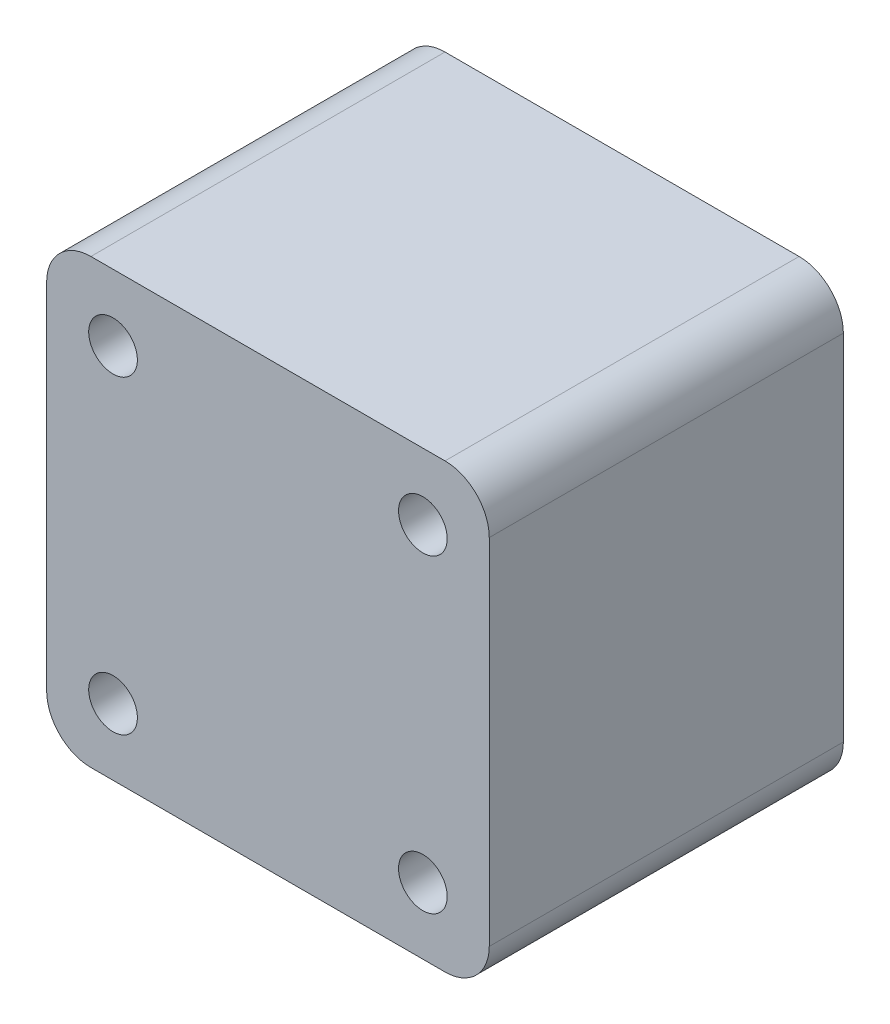
ISO-10303-21;
HEADER;
FILE_DESCRIPTION(('STEP AP214'),'2;1');
FILE_NAME('part.step','',(''),(''),'','','');
FILE_SCHEMA(('AUTOMOTIVE_DESIGN { 1 0 10303 214 1 1 1 1 }'));
ENDSEC;
DATA;
#1=APPLICATION_CONTEXT('core data for automotive mechanical design processes');
#2=APPLICATION_PROTOCOL_DEFINITION('international standard','automotive_design',2000,#1);
#3=PRODUCT_CONTEXT('',#1,'mechanical');
#4=PRODUCT('Part','Part','',(#3));
#5=PRODUCT_RELATED_PRODUCT_CATEGORY('part','',(#4));
#6=PRODUCT_DEFINITION_FORMATION('','',#4);
#7=PRODUCT_DEFINITION_CONTEXT('part definition',#1,'design');
#8=PRODUCT_DEFINITION('design','',#6,#7);
#9=PRODUCT_DEFINITION_SHAPE('','',#8);
#10=(LENGTH_UNIT() NAMED_UNIT(*) SI_UNIT(.MILLI.,.METRE.));
#11=(NAMED_UNIT(*) PLANE_ANGLE_UNIT() SI_UNIT($,.RADIAN.));
#12=(NAMED_UNIT(*) SI_UNIT($,.STERADIAN.) SOLID_ANGLE_UNIT());
#13=UNCERTAINTY_MEASURE_WITH_UNIT(LENGTH_MEASURE(1.E-05),#10,'distance_accuracy_value','');
#14=(GEOMETRIC_REPRESENTATION_CONTEXT(3) GLOBAL_UNCERTAINTY_ASSIGNED_CONTEXT((#13)) GLOBAL_UNIT_ASSIGNED_CONTEXT((#10,
#11,#12)) REPRESENTATION_CONTEXT('',''));
#15=CARTESIAN_POINT('',(0.,0.,0.));
#16=DIRECTION('',(0.,0.,1.));
#17=DIRECTION('',(1.,0.,0.));
#18=AXIS2_PLACEMENT_3D('',#15,#16,#17);
#19=CARTESIAN_POINT('',(50.,50.,80.));
#20=DIRECTION('',(-1.,0.,0.));
#21=DIRECTION('',(0.,-1.,0.));
#22=AXIS2_PLACEMENT_3D('',#19,#20,#21);
#23=PLANE('',#22);
#24=DIRECTION('',(0.,1.,0.));
#25=VECTOR('',#24,1.);
#26=CARTESIAN_POINT('',(50.,50.,0.));
#27=LINE('',#26,#25);
#28=CARTESIAN_POINT('',(50.,-40.,0.));
#29=VERTEX_POINT('',#28);
#30=CARTESIAN_POINT('',(50.,40.,0.));
#31=VERTEX_POINT('',#30);
#32=EDGE_CURVE('E127',#29,#31,#27,.T.);
#33=ORIENTED_EDGE('',*,*,#32,.T.);
#34=DIRECTION('',(0.,0.,-1.));
#35=VECTOR('',#34,1.);
#36=CARTESIAN_POINT('',(50.,40.,80.));
#37=LINE('',#36,#35);
#38=CARTESIAN_POINT('',(50.,40.,80.));
#39=VERTEX_POINT('',#38);
#40=EDGE_CURVE('E145',#31,#39,#37,.F.);
#41=ORIENTED_EDGE('',*,*,#40,.T.);
#42=DIRECTION('',(0.,1.,0.));
#43=VECTOR('',#42,1.);
#44=CARTESIAN_POINT('',(50.,50.,80.));
#45=LINE('',#44,#43);
#46=CARTESIAN_POINT('',(50.,-40.,80.));
#47=VERTEX_POINT('',#46);
#48=EDGE_CURVE('E125',#47,#39,#45,.T.);
#49=ORIENTED_EDGE('',*,*,#48,.F.);
#50=DIRECTION('',(0.,0.,-1.));
#51=VECTOR('',#50,1.);
#52=CARTESIAN_POINT('',(50.,-40.,80.));
#53=LINE('',#52,#51);
#54=EDGE_CURVE('E142',#47,#29,#53,.T.);
#55=ORIENTED_EDGE('',*,*,#54,.T.);
#56=EDGE_LOOP('',(#33,#41,#49,#55));
#57=FACE_BOUND('',#56,.T.);
#58=ADVANCED_FACE('F33',(#57),#23,.F.);
#59=CARTESIAN_POINT('',(-50.,50.,80.));
#60=DIRECTION('',(0.,-1.,0.));
#61=DIRECTION('',(0.,0.,-1.));
#62=AXIS2_PLACEMENT_3D('',#59,#60,#61);
#63=PLANE('',#62);
#64=DIRECTION('',(-1.,0.,0.));
#65=VECTOR('',#64,1.);
#66=CARTESIAN_POINT('',(-50.,50.,80.));
#67=LINE('',#66,#65);
#68=CARTESIAN_POINT('',(40.,50.,80.));
#69=VERTEX_POINT('',#68);
#70=CARTESIAN_POINT('',(-40.,50.,80.));
#71=VERTEX_POINT('',#70);
#72=EDGE_CURVE('E168',#69,#71,#67,.T.);
#73=ORIENTED_EDGE('',*,*,#72,.F.);
#74=DIRECTION('',(0.,0.,-1.));
#75=VECTOR('',#74,1.);
#76=CARTESIAN_POINT('',(40.,50.,80.));
#77=LINE('',#76,#75);
#78=CARTESIAN_POINT('',(40.,50.,0.));
#79=VERTEX_POINT('',#78);
#80=EDGE_CURVE('E134',#69,#79,#77,.T.);
#81=ORIENTED_EDGE('',*,*,#80,.T.);
#82=DIRECTION('',(-1.,0.,0.));
#83=VECTOR('',#82,1.);
#84=CARTESIAN_POINT('',(-50.,50.,0.));
#85=LINE('',#84,#83);
#86=CARTESIAN_POINT('',(-40.,50.,0.));
#87=VERTEX_POINT('',#86);
#88=EDGE_CURVE('E123',#79,#87,#85,.T.);
#89=ORIENTED_EDGE('',*,*,#88,.T.);
#90=DIRECTION('',(0.,0.,-1.));
#91=VECTOR('',#90,1.);
#92=CARTESIAN_POINT('',(-40.,50.,80.));
#93=LINE('',#92,#91);
#94=EDGE_CURVE('E105',#87,#71,#93,.F.);
#95=ORIENTED_EDGE('',*,*,#94,.T.);
#96=EDGE_LOOP('',(#73,#81,#89,#95));
#97=FACE_BOUND('',#96,.T.);
#98=ADVANCED_FACE('F227',(#97),#63,.F.);
#99=CARTESIAN_POINT('',(-50.,50.,80.));
#100=DIRECTION('',(1.,0.,0.));
#101=DIRECTION('',(0.,1.,0.));
#102=AXIS2_PLACEMENT_3D('',#99,#100,#101);
#103=PLANE('',#102);
#104=DIRECTION('',(0.,-1.,0.));
#105=VECTOR('',#104,1.);
#106=CARTESIAN_POINT('',(-50.,50.,0.));
#107=LINE('',#106,#105);
#108=CARTESIAN_POINT('',(-50.,40.,0.));
#109=VERTEX_POINT('',#108);
#110=CARTESIAN_POINT('',(-50.,-40.,0.));
#111=VERTEX_POINT('',#110);
#112=EDGE_CURVE('E114',#109,#111,#107,.T.);
#113=ORIENTED_EDGE('',*,*,#112,.T.);
#114=DIRECTION('',(0.,0.,-1.));
#115=VECTOR('',#114,1.);
#116=CARTESIAN_POINT('',(-50.,-40.,80.));
#117=LINE('',#116,#115);
#118=CARTESIAN_POINT('',(-50.,-40.,80.));
#119=VERTEX_POINT('',#118);
#120=EDGE_CURVE('E11',#111,#119,#117,.F.);
#121=ORIENTED_EDGE('',*,*,#120,.T.);
#122=DIRECTION('',(0.,-1.,0.));
#123=VECTOR('',#122,1.);
#124=CARTESIAN_POINT('',(-50.,50.,80.));
#125=LINE('',#124,#123);
#126=CARTESIAN_POINT('',(-50.,40.,80.));
#127=VERTEX_POINT('',#126);
#128=EDGE_CURVE('E116',#127,#119,#125,.T.);
#129=ORIENTED_EDGE('',*,*,#128,.F.);
#130=DIRECTION('',(0.,0.,-1.));
#131=VECTOR('',#130,1.);
#132=CARTESIAN_POINT('',(-50.,40.,80.));
#133=LINE('',#132,#131);
#134=EDGE_CURVE('E103',#127,#109,#133,.T.);
#135=ORIENTED_EDGE('',*,*,#134,.T.);
#136=EDGE_LOOP('',(#113,#121,#129,#135));
#137=FACE_BOUND('',#136,.T.);
#138=ADVANCED_FACE('F113',(#137),#103,.F.);
#139=CARTESIAN_POINT('',(-50.,-50.,80.));
#140=DIRECTION('',(0.,1.,0.));
#141=DIRECTION('',(0.,0.,1.));
#142=AXIS2_PLACEMENT_3D('',#139,#140,#141);
#143=PLANE('',#142);
#144=DIRECTION('',(1.,0.,0.));
#145=VECTOR('',#144,1.);
#146=CARTESIAN_POINT('',(-50.,-50.,0.));
#147=LINE('',#146,#145);
#148=CARTESIAN_POINT('',(-40.,-50.,0.));
#149=VERTEX_POINT('',#148);
#150=CARTESIAN_POINT('',(40.,-50.,0.));
#151=VERTEX_POINT('',#150);
#152=EDGE_CURVE('E122',#149,#151,#147,.T.);
#153=ORIENTED_EDGE('',*,*,#152,.T.);
#154=DIRECTION('',(0.,0.,-1.));
#155=VECTOR('',#154,1.);
#156=CARTESIAN_POINT('',(40.,-50.,80.));
#157=LINE('',#156,#155);
#158=CARTESIAN_POINT('',(40.,-50.,80.));
#159=VERTEX_POINT('',#158);
#160=EDGE_CURVE('E41',#151,#159,#157,.F.);
#161=ORIENTED_EDGE('',*,*,#160,.T.);
#162=DIRECTION('',(1.,0.,0.));
#163=VECTOR('',#162,1.);
#164=CARTESIAN_POINT('',(-50.,-50.,80.));
#165=LINE('',#164,#163);
#166=CARTESIAN_POINT('',(-40.,-50.,80.));
#167=VERTEX_POINT('',#166);
#168=EDGE_CURVE('E117',#167,#159,#165,.T.);
#169=ORIENTED_EDGE('',*,*,#168,.F.);
#170=DIRECTION('',(0.,0.,-1.));
#171=VECTOR('',#170,1.);
#172=CARTESIAN_POINT('',(-40.,-50.,80.));
#173=LINE('',#172,#171);
#174=EDGE_CURVE('E152',#167,#149,#173,.T.);
#175=ORIENTED_EDGE('',*,*,#174,.T.);
#176=EDGE_LOOP('',(#153,#161,#169,#175));
#177=FACE_BOUND('',#176,.T.);
#178=ADVANCED_FACE('F155',(#177),#143,.F.);
#179=CARTESIAN_POINT('',(0.,0.,80.));
#180=DIRECTION('',(0.,0.,1.));
#181=DIRECTION('',(1.,0.,0.));
#182=AXIS2_PLACEMENT_3D('',#179,#180,#181);
#183=PLANE('',#182);
#184=CARTESIAN_POINT('',(35.,35.,80.));
#185=DIRECTION('',(0.,0.,1.));
#186=DIRECTION('',(1.,0.,0.));
#187=AXIS2_PLACEMENT_3D('',#184,#185,#186);
#188=CIRCLE('',#187,5.5);
#189=CARTESIAN_POINT('',(40.5,35.,80.));
#190=VERTEX_POINT('',#189);
#191=EDGE_CURVE('E190',#190,#190,#188,.T.);
#192=ORIENTED_EDGE('',*,*,#191,.F.);
#193=EDGE_LOOP('',(#192));
#194=FACE_BOUND('',#193,.T.);
#195=CARTESIAN_POINT('',(-35.,-35.,80.));
#196=DIRECTION('',(0.,0.,1.));
#197=DIRECTION('',(1.,0.,0.));
#198=AXIS2_PLACEMENT_3D('',#195,#196,#197);
#199=CIRCLE('',#198,5.49999999999999);
#200=CARTESIAN_POINT('',(-29.5,-35.,80.));
#201=VERTEX_POINT('',#200);
#202=EDGE_CURVE('E183',#201,#201,#199,.T.);
#203=ORIENTED_EDGE('',*,*,#202,.F.);
#204=EDGE_LOOP('',(#203));
#205=FACE_BOUND('',#204,.T.);
#206=CARTESIAN_POINT('',(35.,-35.,80.));
#207=DIRECTION('',(0.,0.,1.));
#208=DIRECTION('',(1.,0.,0.));
#209=AXIS2_PLACEMENT_3D('',#206,#207,#208);
#210=CIRCLE('',#209,5.5);
#211=CARTESIAN_POINT('',(40.5,-35.,80.));
#212=VERTEX_POINT('',#211);
#213=EDGE_CURVE('E195',#212,#212,#210,.T.);
#214=ORIENTED_EDGE('',*,*,#213,.F.);
#215=EDGE_LOOP('',(#214));
#216=FACE_BOUND('',#215,.T.);
#217=CARTESIAN_POINT('',(-35.,35.,80.));
#218=DIRECTION('',(0.,0.,1.));
#219=DIRECTION('',(1.,0.,0.));
#220=AXIS2_PLACEMENT_3D('',#217,#218,#219);
#221=CIRCLE('',#220,5.49999999999999);
#222=CARTESIAN_POINT('',(-29.5,35.,80.));
#223=VERTEX_POINT('',#222);
#224=EDGE_CURVE('E172',#223,#223,#221,.T.);
#225=ORIENTED_EDGE('',*,*,#224,.F.);
#226=EDGE_LOOP('',(#225));
#227=FACE_BOUND('',#226,.T.);
#228=ORIENTED_EDGE('',*,*,#48,.T.);
#229=CARTESIAN_POINT('',(40.,40.,80.));
#230=DIRECTION('',(0.,0.,1.));
#231=DIRECTION('',(1.,0.,0.));
#232=AXIS2_PLACEMENT_3D('',#229,#230,#231);
#233=CIRCLE('',#232,10.);
#234=EDGE_CURVE('E150',#39,#69,#233,.T.);
#235=ORIENTED_EDGE('',*,*,#234,.T.);
#236=ORIENTED_EDGE('',*,*,#72,.T.);
#237=CARTESIAN_POINT('',(-40.,40.,80.));
#238=DIRECTION('',(0.,0.,1.));
#239=DIRECTION('',(1.,0.,0.));
#240=AXIS2_PLACEMENT_3D('',#237,#238,#239);
#241=CIRCLE('',#240,10.);
#242=EDGE_CURVE('E132',#71,#127,#241,.T.);
#243=ORIENTED_EDGE('',*,*,#242,.T.);
#244=ORIENTED_EDGE('',*,*,#128,.T.);
#245=CARTESIAN_POINT('',(-40.,-40.,80.));
#246=DIRECTION('',(0.,0.,1.));
#247=DIRECTION('',(1.,0.,0.));
#248=AXIS2_PLACEMENT_3D('',#245,#246,#247);
#249=CIRCLE('',#248,10.);
#250=EDGE_CURVE('E54',#119,#167,#249,.T.);
#251=ORIENTED_EDGE('',*,*,#250,.T.);
#252=ORIENTED_EDGE('',*,*,#168,.T.);
#253=CARTESIAN_POINT('',(40.,-40.,80.));
#254=DIRECTION('',(0.,0.,1.));
#255=DIRECTION('',(1.,0.,0.));
#256=AXIS2_PLACEMENT_3D('',#253,#254,#255);
#257=CIRCLE('',#256,10.);
#258=EDGE_CURVE('E148',#159,#47,#257,.T.);
#259=ORIENTED_EDGE('',*,*,#258,.T.);
#260=EDGE_LOOP('',(#228,#235,#236,#243,#244,#251,#252,#259));
#261=FACE_BOUND('',#260,.T.);
#262=ADVANCED_FACE('F210',(#194,#205,#216,#227,#261),#183,.T.);
#263=CARTESIAN_POINT('',(0.,0.,0.));
#264=DIRECTION('',(0.,0.,1.));
#265=DIRECTION('',(1.,0.,0.));
#266=AXIS2_PLACEMENT_3D('',#263,#264,#265);
#267=PLANE('',#266);
#268=CARTESIAN_POINT('',(35.,35.,0.));
#269=DIRECTION('',(0.,0.,1.));
#270=DIRECTION('',(1.,0.,0.));
#271=AXIS2_PLACEMENT_3D('',#268,#269,#270);
#272=CIRCLE('',#271,5.5);
#273=CARTESIAN_POINT('',(40.5,35.,0.));
#274=VERTEX_POINT('',#273);
#275=EDGE_CURVE('E181',#274,#274,#272,.T.);
#276=ORIENTED_EDGE('',*,*,#275,.T.);
#277=EDGE_LOOP('',(#276));
#278=FACE_BOUND('',#277,.T.);
#279=CARTESIAN_POINT('',(-35.,-35.,0.));
#280=DIRECTION('',(0.,0.,1.));
#281=DIRECTION('',(1.,0.,0.));
#282=AXIS2_PLACEMENT_3D('',#279,#280,#281);
#283=CIRCLE('',#282,5.49999999999999);
#284=CARTESIAN_POINT('',(-29.5,-35.,0.));
#285=VERTEX_POINT('',#284);
#286=EDGE_CURVE('E186',#285,#285,#283,.T.);
#287=ORIENTED_EDGE('',*,*,#286,.T.);
#288=EDGE_LOOP('',(#287));
#289=FACE_BOUND('',#288,.T.);
#290=CARTESIAN_POINT('',(35.,-35.,0.));
#291=DIRECTION('',(0.,0.,1.));
#292=DIRECTION('',(1.,0.,0.));
#293=AXIS2_PLACEMENT_3D('',#290,#291,#292);
#294=CIRCLE('',#293,5.5);
#295=CARTESIAN_POINT('',(40.5,-35.,0.));
#296=VERTEX_POINT('',#295);
#297=EDGE_CURVE('E187',#296,#296,#294,.T.);
#298=ORIENTED_EDGE('',*,*,#297,.T.);
#299=EDGE_LOOP('',(#298));
#300=FACE_BOUND('',#299,.T.);
#301=CARTESIAN_POINT('',(-35.,35.,0.));
#302=DIRECTION('',(0.,0.,1.));
#303=DIRECTION('',(1.,0.,0.));
#304=AXIS2_PLACEMENT_3D('',#301,#302,#303);
#305=CIRCLE('',#304,5.49999999999999);
#306=CARTESIAN_POINT('',(-29.5,35.,0.));
#307=VERTEX_POINT('',#306);
#308=EDGE_CURVE('E176',#307,#307,#305,.T.);
#309=ORIENTED_EDGE('',*,*,#308,.T.);
#310=EDGE_LOOP('',(#309));
#311=FACE_BOUND('',#310,.T.);
#312=ORIENTED_EDGE('',*,*,#88,.F.);
#313=CARTESIAN_POINT('',(40.,40.,0.));
#314=DIRECTION('',(0.,0.,1.));
#315=DIRECTION('',(1.,0.,0.));
#316=AXIS2_PLACEMENT_3D('',#313,#314,#315);
#317=CIRCLE('',#316,10.);
#318=EDGE_CURVE('E140',#79,#31,#317,.F.);
#319=ORIENTED_EDGE('',*,*,#318,.T.);
#320=ORIENTED_EDGE('',*,*,#32,.F.);
#321=CARTESIAN_POINT('',(40.,-40.,0.));
#322=DIRECTION('',(0.,0.,1.));
#323=DIRECTION('',(1.,0.,0.));
#324=AXIS2_PLACEMENT_3D('',#321,#322,#323);
#325=CIRCLE('',#324,10.);
#326=EDGE_CURVE('E138',#29,#151,#325,.F.);
#327=ORIENTED_EDGE('',*,*,#326,.T.);
#328=ORIENTED_EDGE('',*,*,#152,.F.);
#329=CARTESIAN_POINT('',(-40.,-40.,0.));
#330=DIRECTION('',(0.,0.,1.));
#331=DIRECTION('',(1.,0.,0.));
#332=AXIS2_PLACEMENT_3D('',#329,#330,#331);
#333=CIRCLE('',#332,10.);
#334=EDGE_CURVE('E121',#149,#111,#333,.F.);
#335=ORIENTED_EDGE('',*,*,#334,.T.);
#336=ORIENTED_EDGE('',*,*,#112,.F.);
#337=CARTESIAN_POINT('',(-40.,40.,0.));
#338=DIRECTION('',(0.,0.,1.));
#339=DIRECTION('',(1.,0.,0.));
#340=AXIS2_PLACEMENT_3D('',#337,#338,#339);
#341=CIRCLE('',#340,10.);
#342=EDGE_CURVE('E99',#109,#87,#341,.F.);
#343=ORIENTED_EDGE('',*,*,#342,.T.);
#344=EDGE_LOOP('',(#312,#319,#320,#327,#328,#335,#336,#343));
#345=FACE_BOUND('',#344,.T.);
#346=ADVANCED_FACE('F119',(#278,#289,#300,#311,#345),#267,.F.);
#347=CARTESIAN_POINT('',(-35.,35.,0.));
#348=DIRECTION('',(0.,0.,1.));
#349=DIRECTION('',(1.,0.,0.));
#350=AXIS2_PLACEMENT_3D('',#347,#348,#349);
#351=CYLINDRICAL_SURFACE('',#350,5.49999999999999);
#352=ORIENTED_EDGE('',*,*,#308,.F.);
#353=EDGE_LOOP('',(#352));
#354=FACE_BOUND('',#353,.T.);
#355=ORIENTED_EDGE('',*,*,#224,.T.);
#356=EDGE_LOOP('',(#355));
#357=FACE_BOUND('',#356,.T.);
#358=ADVANCED_FACE('F206',(#354,#357),#351,.F.);
#359=CARTESIAN_POINT('',(35.,-35.,0.));
#360=DIRECTION('',(0.,0.,1.));
#361=DIRECTION('',(1.,0.,0.));
#362=AXIS2_PLACEMENT_3D('',#359,#360,#361);
#363=CYLINDRICAL_SURFACE('',#362,5.5);
#364=ORIENTED_EDGE('',*,*,#297,.F.);
#365=EDGE_LOOP('',(#364));
#366=FACE_BOUND('',#365,.T.);
#367=ORIENTED_EDGE('',*,*,#213,.T.);
#368=EDGE_LOOP('',(#367));
#369=FACE_BOUND('',#368,.T.);
#370=ADVANCED_FACE('F202',(#366,#369),#363,.F.);
#371=CARTESIAN_POINT('',(-35.,-35.,0.));
#372=DIRECTION('',(0.,0.,1.));
#373=DIRECTION('',(1.,0.,0.));
#374=AXIS2_PLACEMENT_3D('',#371,#372,#373);
#375=CYLINDRICAL_SURFACE('',#374,5.49999999999999);
#376=ORIENTED_EDGE('',*,*,#286,.F.);
#377=EDGE_LOOP('',(#376));
#378=FACE_BOUND('',#377,.T.);
#379=ORIENTED_EDGE('',*,*,#202,.T.);
#380=EDGE_LOOP('',(#379));
#381=FACE_BOUND('',#380,.T.);
#382=ADVANCED_FACE('F205',(#378,#381),#375,.F.);
#383=CARTESIAN_POINT('',(35.,35.,0.));
#384=DIRECTION('',(0.,0.,1.));
#385=DIRECTION('',(1.,0.,0.));
#386=AXIS2_PLACEMENT_3D('',#383,#384,#385);
#387=CYLINDRICAL_SURFACE('',#386,5.5);
#388=ORIENTED_EDGE('',*,*,#275,.F.);
#389=EDGE_LOOP('',(#388));
#390=FACE_BOUND('',#389,.T.);
#391=ORIENTED_EDGE('',*,*,#191,.T.);
#392=EDGE_LOOP('',(#391));
#393=FACE_BOUND('',#392,.T.);
#394=ADVANCED_FACE('F239',(#390,#393),#387,.F.);
#395=CARTESIAN_POINT('',(-40.,40.,80.));
#396=DIRECTION('',(0.,0.,-1.));
#397=DIRECTION('',(-1.,0.,0.));
#398=AXIS2_PLACEMENT_3D('',#395,#396,#397);
#399=CYLINDRICAL_SURFACE('',#398,10.);
#400=ORIENTED_EDGE('',*,*,#242,.F.);
#401=ORIENTED_EDGE('',*,*,#94,.F.);
#402=ORIENTED_EDGE('',*,*,#342,.F.);
#403=ORIENTED_EDGE('',*,*,#134,.F.);
#404=EDGE_LOOP('',(#400,#401,#402,#403));
#405=FACE_BOUND('',#404,.T.);
#406=ADVANCED_FACE('F102',(#405),#399,.T.);
#407=CARTESIAN_POINT('',(40.,40.,80.));
#408=DIRECTION('',(0.,0.,-1.));
#409=DIRECTION('',(-1.,0.,0.));
#410=AXIS2_PLACEMENT_3D('',#407,#408,#409);
#411=CYLINDRICAL_SURFACE('',#410,10.);
#412=ORIENTED_EDGE('',*,*,#234,.F.);
#413=ORIENTED_EDGE('',*,*,#40,.F.);
#414=ORIENTED_EDGE('',*,*,#318,.F.);
#415=ORIENTED_EDGE('',*,*,#80,.F.);
#416=EDGE_LOOP('',(#412,#413,#414,#415));
#417=FACE_BOUND('',#416,.T.);
#418=ADVANCED_FACE('F238',(#417),#411,.T.);
#419=CARTESIAN_POINT('',(40.,-40.,80.));
#420=DIRECTION('',(0.,0.,-1.));
#421=DIRECTION('',(-1.,0.,0.));
#422=AXIS2_PLACEMENT_3D('',#419,#420,#421);
#423=CYLINDRICAL_SURFACE('',#422,10.);
#424=ORIENTED_EDGE('',*,*,#258,.F.);
#425=ORIENTED_EDGE('',*,*,#160,.F.);
#426=ORIENTED_EDGE('',*,*,#326,.F.);
#427=ORIENTED_EDGE('',*,*,#54,.F.);
#428=EDGE_LOOP('',(#424,#425,#426,#427));
#429=FACE_BOUND('',#428,.T.);
#430=ADVANCED_FACE('F162',(#429),#423,.T.);
#431=CARTESIAN_POINT('',(-40.,-40.,80.));
#432=DIRECTION('',(0.,0.,-1.));
#433=DIRECTION('',(-1.,0.,0.));
#434=AXIS2_PLACEMENT_3D('',#431,#432,#433);
#435=CYLINDRICAL_SURFACE('',#434,10.);
#436=ORIENTED_EDGE('',*,*,#250,.F.);
#437=ORIENTED_EDGE('',*,*,#120,.F.);
#438=ORIENTED_EDGE('',*,*,#334,.F.);
#439=ORIENTED_EDGE('',*,*,#174,.F.);
#440=EDGE_LOOP('',(#436,#437,#438,#439));
#441=FACE_BOUND('',#440,.T.);
#442=ADVANCED_FACE('F35',(#441),#435,.T.);
#443=CLOSED_SHELL('',(#58,#98,#138,#178,#262,#346,#358,#370,#382,#394,#406,#418,#430,#442));
#444=MANIFOLD_SOLID_BREP('B2',#443);
#445=ADVANCED_BREP_SHAPE_REPRESENTATION('',(#18,#444),#14);
#446=SHAPE_DEFINITION_REPRESENTATION(#9,#445);
ENDSEC;
END-ISO-10303-21;
